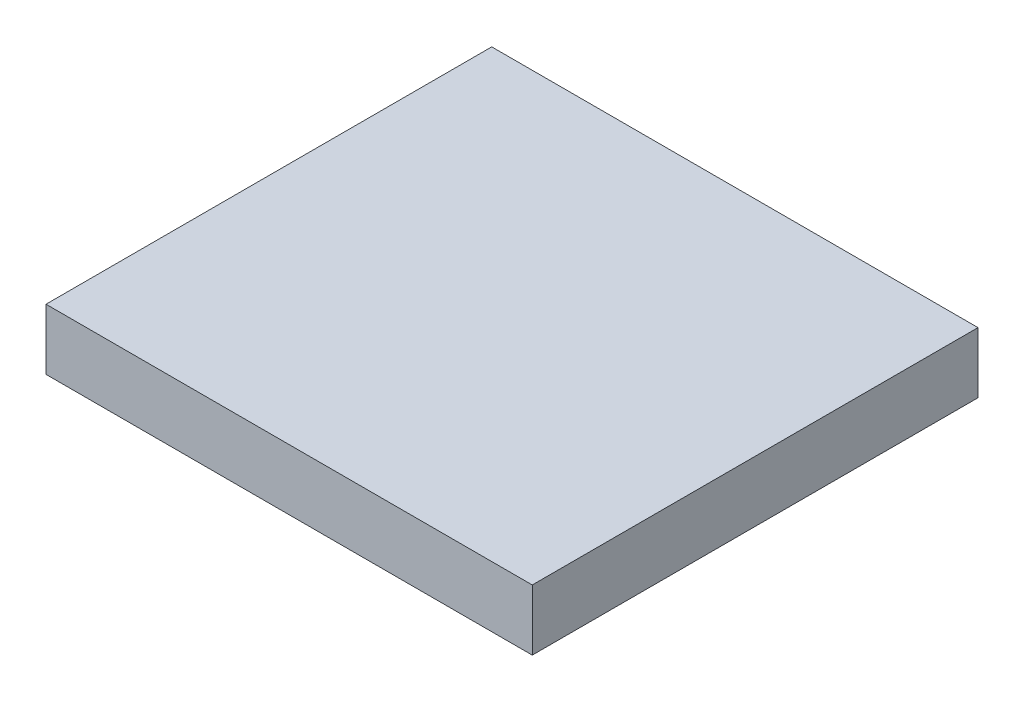
ISO-10303-21;
HEADER;
FILE_DESCRIPTION(('STEP AP214'),'2;1');
FILE_NAME('part.step','',(''),(''),'','','');
FILE_SCHEMA(('AUTOMOTIVE_DESIGN { 1 0 10303 214 1 1 1 1 }'));
ENDSEC;
DATA;
#1=APPLICATION_CONTEXT('core data for automotive mechanical design processes');
#2=APPLICATION_PROTOCOL_DEFINITION('international standard','automotive_design',2000,#1);
#3=PRODUCT_CONTEXT('',#1,'mechanical');
#4=PRODUCT('Part','Part','',(#3));
#5=PRODUCT_RELATED_PRODUCT_CATEGORY('part','',(#4));
#6=PRODUCT_DEFINITION_FORMATION('','',#4);
#7=PRODUCT_DEFINITION_CONTEXT('part definition',#1,'design');
#8=PRODUCT_DEFINITION('design','',#6,#7);
#9=PRODUCT_DEFINITION_SHAPE('','',#8);
#10=(LENGTH_UNIT() NAMED_UNIT(*) SI_UNIT(.MILLI.,.METRE.));
#11=(NAMED_UNIT(*) PLANE_ANGLE_UNIT() SI_UNIT($,.RADIAN.));
#12=(NAMED_UNIT(*) SI_UNIT($,.STERADIAN.) SOLID_ANGLE_UNIT());
#13=UNCERTAINTY_MEASURE_WITH_UNIT(LENGTH_MEASURE(1.E-05),#10,'distance_accuracy_value','');
#14=(GEOMETRIC_REPRESENTATION_CONTEXT(3) GLOBAL_UNCERTAINTY_ASSIGNED_CONTEXT((#13)) GLOBAL_UNIT_ASSIGNED_CONTEXT((#10,
#11,#12)) REPRESENTATION_CONTEXT('',''));
#15=CARTESIAN_POINT('',(0.,0.,0.));
#16=DIRECTION('',(0.,0.,1.));
#17=DIRECTION('',(1.,0.,0.));
#18=AXIS2_PLACEMENT_3D('',#15,#16,#17);
#19=CARTESIAN_POINT('',(-1200.,-230.,1100.));
#20=DIRECTION('',(1.,0.,0.));
#21=DIRECTION('',(0.,0.,-1.));
#22=AXIS2_PLACEMENT_3D('',#19,#20,#21);
#23=PLANE('',#22);
#24=DIRECTION('',(0.,-1.,0.));
#25=VECTOR('',#24,1.);
#26=CARTESIAN_POINT('',(-1200.,-230.,-1100.));
#27=LINE('',#26,#25);
#28=CARTESIAN_POINT('',(-1200.,69.9999999999999,-1100.));
#29=VERTEX_POINT('',#28);
#30=CARTESIAN_POINT('',(-1200.,-230.,-1100.));
#31=VERTEX_POINT('',#30);
#32=EDGE_CURVE('E105',#29,#31,#27,.T.);
#33=ORIENTED_EDGE('',*,*,#32,.T.);
#34=DIRECTION('',(0.,0.,-1.));
#35=VECTOR('',#34,1.);
#36=CARTESIAN_POINT('',(-1200.,-230.,1100.));
#37=LINE('',#36,#35);
#38=CARTESIAN_POINT('',(-1200.,-230.,1100.));
#39=VERTEX_POINT('',#38);
#40=EDGE_CURVE('E11',#39,#31,#37,.T.);
#41=ORIENTED_EDGE('',*,*,#40,.F.);
#42=DIRECTION('',(0.,-1.,0.));
#43=VECTOR('',#42,1.);
#44=CARTESIAN_POINT('',(-1200.,-230.,1100.));
#45=LINE('',#44,#43);
#46=CARTESIAN_POINT('',(-1200.,69.9999999999999,1100.));
#47=VERTEX_POINT('',#46);
#48=EDGE_CURVE('E89',#47,#39,#45,.T.);
#49=ORIENTED_EDGE('',*,*,#48,.F.);
#50=DIRECTION('',(0.,0.,-1.));
#51=VECTOR('',#50,1.);
#52=CARTESIAN_POINT('',(-1200.,69.9999999999999,1100.));
#53=LINE('',#52,#51);
#54=EDGE_CURVE('E98',#47,#29,#53,.T.);
#55=ORIENTED_EDGE('',*,*,#54,.T.);
#56=EDGE_LOOP('',(#33,#41,#49,#55));
#57=FACE_BOUND('',#56,.T.);
#58=ADVANCED_FACE('F39',(#57),#23,.F.);
#59=CARTESIAN_POINT('',(-1200.,-230.,1100.));
#60=DIRECTION('',(0.,1.,0.));
#61=DIRECTION('',(0.,0.,1.));
#62=AXIS2_PLACEMENT_3D('',#59,#60,#61);
#63=PLANE('',#62);
#64=DIRECTION('',(1.,0.,0.));
#65=VECTOR('',#64,1.);
#66=CARTESIAN_POINT('',(-1200.,-230.,-1100.));
#67=LINE('',#66,#65);
#68=CARTESIAN_POINT('',(1200.,-230.,-1100.));
#69=VERTEX_POINT('',#68);
#70=EDGE_CURVE('E94',#31,#69,#67,.T.);
#71=ORIENTED_EDGE('',*,*,#70,.T.);
#72=DIRECTION('',(0.,0.,-1.));
#73=VECTOR('',#72,1.);
#74=CARTESIAN_POINT('',(1200.,-230.,1100.));
#75=LINE('',#74,#73);
#76=CARTESIAN_POINT('',(1200.,-230.,1100.));
#77=VERTEX_POINT('',#76);
#78=EDGE_CURVE('E50',#77,#69,#75,.T.);
#79=ORIENTED_EDGE('',*,*,#78,.F.);
#80=DIRECTION('',(1.,0.,0.));
#81=VECTOR('',#80,1.);
#82=CARTESIAN_POINT('',(-1200.,-230.,1100.));
#83=LINE('',#82,#81);
#84=EDGE_CURVE('E83',#39,#77,#83,.T.);
#85=ORIENTED_EDGE('',*,*,#84,.F.);
#86=ORIENTED_EDGE('',*,*,#40,.T.);
#87=EDGE_LOOP('',(#71,#79,#85,#86));
#88=FACE_BOUND('',#87,.T.);
#89=ADVANCED_FACE('F91',(#88),#63,.F.);
#90=CARTESIAN_POINT('',(1200.,-230.,1100.));
#91=DIRECTION('',(-1.,0.,0.));
#92=DIRECTION('',(0.,0.,1.));
#93=AXIS2_PLACEMENT_3D('',#90,#91,#92);
#94=PLANE('',#93);
#95=DIRECTION('',(0.,1.,0.));
#96=VECTOR('',#95,1.);
#97=CARTESIAN_POINT('',(1200.,-230.,-1100.));
#98=LINE('',#97,#96);
#99=CARTESIAN_POINT('',(1200.,69.9999999999999,-1100.));
#100=VERTEX_POINT('',#99);
#101=EDGE_CURVE('E75',#69,#100,#98,.T.);
#102=ORIENTED_EDGE('',*,*,#101,.T.);
#103=DIRECTION('',(0.,0.,-1.));
#104=VECTOR('',#103,1.);
#105=CARTESIAN_POINT('',(1200.,69.9999999999999,1100.));
#106=LINE('',#105,#104);
#107=CARTESIAN_POINT('',(1200.,69.9999999999999,1100.));
#108=VERTEX_POINT('',#107);
#109=EDGE_CURVE('E92',#108,#100,#106,.T.);
#110=ORIENTED_EDGE('',*,*,#109,.F.);
#111=DIRECTION('',(0.,1.,0.));
#112=VECTOR('',#111,1.);
#113=CARTESIAN_POINT('',(1200.,-230.,1100.));
#114=LINE('',#113,#112);
#115=EDGE_CURVE('E86',#77,#108,#114,.T.);
#116=ORIENTED_EDGE('',*,*,#115,.F.);
#117=ORIENTED_EDGE('',*,*,#78,.T.);
#118=EDGE_LOOP('',(#102,#110,#116,#117));
#119=FACE_BOUND('',#118,.T.);
#120=ADVANCED_FACE('F96',(#119),#94,.F.);
#121=CARTESIAN_POINT('',(-1200.,69.9999999999999,1100.));
#122=DIRECTION('',(0.,-1.,0.));
#123=DIRECTION('',(0.,0.,-1.));
#124=AXIS2_PLACEMENT_3D('',#121,#122,#123);
#125=PLANE('',#124);
#126=DIRECTION('',(-1.,0.,0.));
#127=VECTOR('',#126,1.);
#128=CARTESIAN_POINT('',(-1200.,69.9999999999999,-1100.));
#129=LINE('',#128,#127);
#130=EDGE_CURVE('E79',#100,#29,#129,.T.);
#131=ORIENTED_EDGE('',*,*,#130,.T.);
#132=ORIENTED_EDGE('',*,*,#54,.F.);
#133=DIRECTION('',(-1.,0.,0.));
#134=VECTOR('',#133,1.);
#135=CARTESIAN_POINT('',(-1200.,69.9999999999999,1100.));
#136=LINE('',#135,#134);
#137=EDGE_CURVE('E54',#108,#47,#136,.T.);
#138=ORIENTED_EDGE('',*,*,#137,.F.);
#139=ORIENTED_EDGE('',*,*,#109,.T.);
#140=EDGE_LOOP('',(#131,#132,#138,#139));
#141=FACE_BOUND('',#140,.T.);
#142=ADVANCED_FACE('F108',(#141),#125,.F.);
#143=CARTESIAN_POINT('',(0.,0.,1100.));
#144=DIRECTION('',(0.,0.,-1.));
#145=DIRECTION('',(-1.,0.,0.));
#146=AXIS2_PLACEMENT_3D('',#143,#144,#145);
#147=PLANE('',#146);
#148=ORIENTED_EDGE('',*,*,#48,.T.);
#149=ORIENTED_EDGE('',*,*,#84,.T.);
#150=ORIENTED_EDGE('',*,*,#115,.T.);
#151=ORIENTED_EDGE('',*,*,#137,.T.);
#152=EDGE_LOOP('',(#148,#149,#150,#151));
#153=FACE_BOUND('',#152,.T.);
#154=ADVANCED_FACE('F88',(#153),#147,.F.);
#155=CARTESIAN_POINT('',(0.,0.,-1100.));
#156=DIRECTION('',(0.,0.,-1.));
#157=DIRECTION('',(-1.,0.,0.));
#158=AXIS2_PLACEMENT_3D('',#155,#156,#157);
#159=PLANE('',#158);
#160=ORIENTED_EDGE('',*,*,#32,.F.);
#161=ORIENTED_EDGE('',*,*,#130,.F.);
#162=ORIENTED_EDGE('',*,*,#101,.F.);
#163=ORIENTED_EDGE('',*,*,#70,.F.);
#164=EDGE_LOOP('',(#160,#161,#162,#163));
#165=FACE_BOUND('',#164,.T.);
#166=ADVANCED_FACE('F115',(#165),#159,.T.);
#167=CLOSED_SHELL('',(#58,#89,#120,#142,#154,#166));
#168=MANIFOLD_SOLID_BREP('B2',#167);
#169=ADVANCED_BREP_SHAPE_REPRESENTATION('',(#18,#168),#14);
#170=SHAPE_DEFINITION_REPRESENTATION(#9,#169);
ENDSEC;
END-ISO-10303-21;
